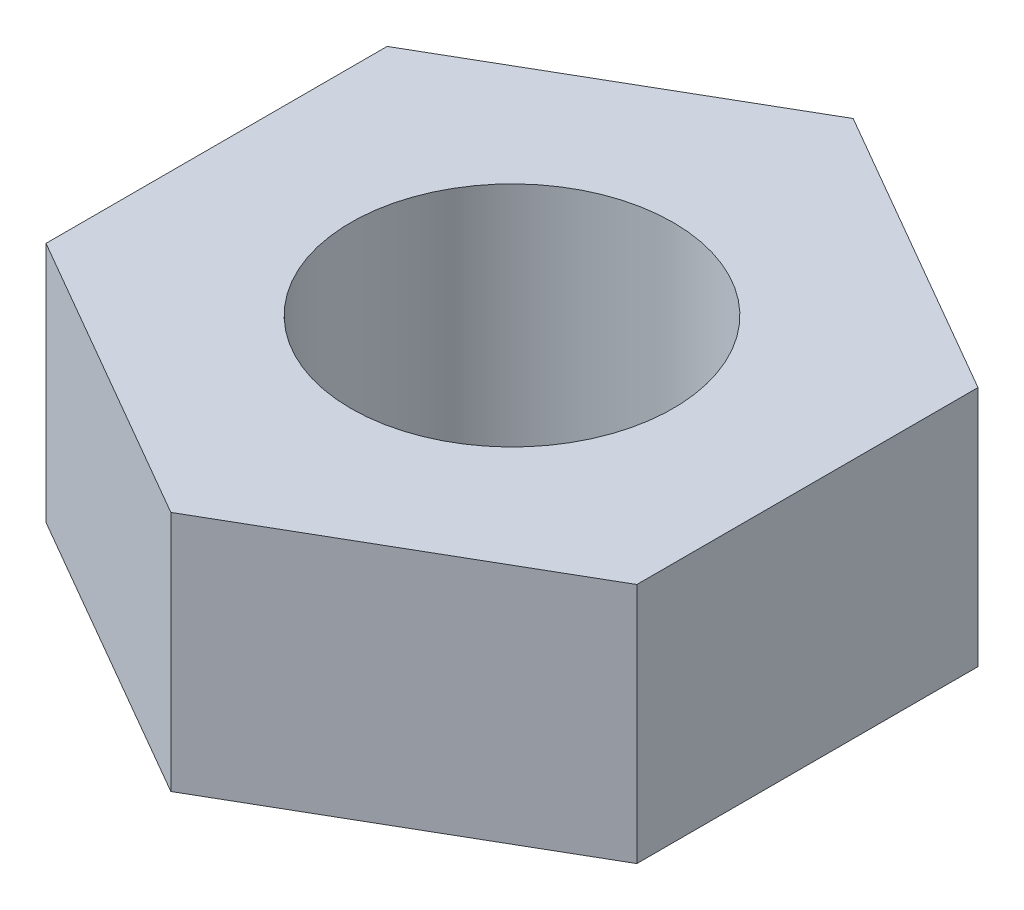
ISO-10303-21;
HEADER;
FILE_DESCRIPTION(('STEP AP214'),'2;1');
FILE_NAME('part.step','',(''),(''),'','','');
FILE_SCHEMA(('AUTOMOTIVE_DESIGN { 1 0 10303 214 1 1 1 1 }'));
ENDSEC;
DATA;
#1=APPLICATION_CONTEXT('core data for automotive mechanical design processes');
#2=APPLICATION_PROTOCOL_DEFINITION('international standard','automotive_design',2000,#1);
#3=PRODUCT_CONTEXT('',#1,'mechanical');
#4=PRODUCT('Part','Part','',(#3));
#5=PRODUCT_RELATED_PRODUCT_CATEGORY('part','',(#4));
#6=PRODUCT_DEFINITION_FORMATION('','',#4);
#7=PRODUCT_DEFINITION_CONTEXT('part definition',#1,'design');
#8=PRODUCT_DEFINITION('design','',#6,#7);
#9=PRODUCT_DEFINITION_SHAPE('','',#8);
#10=(LENGTH_UNIT() NAMED_UNIT(*) SI_UNIT(.MILLI.,.METRE.));
#11=(NAMED_UNIT(*) PLANE_ANGLE_UNIT() SI_UNIT($,.RADIAN.));
#12=(NAMED_UNIT(*) SI_UNIT($,.STERADIAN.) SOLID_ANGLE_UNIT());
#13=UNCERTAINTY_MEASURE_WITH_UNIT(LENGTH_MEASURE(1.E-05),#10,'distance_accuracy_value','');
#14=(GEOMETRIC_REPRESENTATION_CONTEXT(3) GLOBAL_UNCERTAINTY_ASSIGNED_CONTEXT((#13)) GLOBAL_UNIT_ASSIGNED_CONTEXT((#10,
#11,#12)) REPRESENTATION_CONTEXT('',''));
#15=CARTESIAN_POINT('',(0.,0.,0.));
#16=DIRECTION('',(0.,0.,1.));
#17=DIRECTION('',(1.,0.,0.));
#18=AXIS2_PLACEMENT_3D('',#15,#16,#17);
#19=CARTESIAN_POINT('',(0.,2.25,0.));
#20=DIRECTION('',(0.,1.,0.));
#21=DIRECTION('',(0.,0.,1.));
#22=AXIS2_PLACEMENT_3D('',#19,#20,#21);
#23=PLANE('',#22);
#24=DIRECTION('',(-0.866025403784438,0.,-0.5));
#25=VECTOR('',#24,1.);
#26=CARTESIAN_POINT('',(2.75,2.25,-1.58771324027147));
#27=LINE('',#26,#25);
#28=CARTESIAN_POINT('',(2.75,2.25,-1.58771324027147));
#29=VERTEX_POINT('',#28);
#30=CARTESIAN_POINT('',(0.,2.25,-3.17542648054294));
#31=VERTEX_POINT('',#30);
#32=EDGE_CURVE('E129',#29,#31,#27,.T.);
#33=ORIENTED_EDGE('',*,*,#32,.T.);
#34=DIRECTION('',(-0.866025403784439,0.,0.5));
#35=VECTOR('',#34,1.);
#36=CARTESIAN_POINT('',(0.,2.25,-3.17542648054294));
#37=LINE('',#36,#35);
#38=CARTESIAN_POINT('',(-2.75,2.25,-1.58771324027147));
#39=VERTEX_POINT('',#38);
#40=EDGE_CURVE('E87',#31,#39,#37,.T.);
#41=ORIENTED_EDGE('',*,*,#40,.T.);
#42=DIRECTION('',(0.,0.,1.));
#43=VECTOR('',#42,1.);
#44=CARTESIAN_POINT('',(-2.75,2.25,-1.58771324027147));
#45=LINE('',#44,#43);
#46=CARTESIAN_POINT('',(-2.75,2.25,1.58771324027147));
#47=VERTEX_POINT('',#46);
#48=EDGE_CURVE('E100',#39,#47,#45,.T.);
#49=ORIENTED_EDGE('',*,*,#48,.T.);
#50=DIRECTION('',(0.866025403784439,0.,0.5));
#51=VECTOR('',#50,1.);
#52=CARTESIAN_POINT('',(-2.75,2.25,1.58771324027147));
#53=LINE('',#52,#51);
#54=CARTESIAN_POINT('',(0.,2.25,3.17542648054294));
#55=VERTEX_POINT('',#54);
#56=EDGE_CURVE('E94',#47,#55,#53,.T.);
#57=ORIENTED_EDGE('',*,*,#56,.T.);
#58=DIRECTION('',(0.866025403784439,0.,-0.5));
#59=VECTOR('',#58,1.);
#60=CARTESIAN_POINT('',(0.,2.25,3.17542648054294));
#61=LINE('',#60,#59);
#62=CARTESIAN_POINT('',(2.75,2.25,1.58771324027147));
#63=VERTEX_POINT('',#62);
#64=EDGE_CURVE('E98',#55,#63,#61,.T.);
#65=ORIENTED_EDGE('',*,*,#64,.T.);
#66=DIRECTION('',(0.,0.,-1.));
#67=VECTOR('',#66,1.);
#68=CARTESIAN_POINT('',(2.75,2.25,1.58771324027147));
#69=LINE('',#68,#67);
#70=EDGE_CURVE('E50',#63,#29,#69,.T.);
#71=ORIENTED_EDGE('',*,*,#70,.T.);
#72=EDGE_LOOP('',(#33,#41,#49,#57,#65,#71));
#73=FACE_BOUND('',#72,.T.);
#74=CARTESIAN_POINT('',(0.,2.25,0.));
#75=DIRECTION('',(0.,1.,0.));
#76=DIRECTION('',(0.,0.,1.));
#77=AXIS2_PLACEMENT_3D('',#74,#75,#76);
#78=CIRCLE('',#77,1.5);
#79=CARTESIAN_POINT('',(0.,2.25,1.5));
#80=VERTEX_POINT('',#79);
#81=EDGE_CURVE('E122',#80,#80,#78,.T.);
#82=ORIENTED_EDGE('',*,*,#81,.F.);
#83=EDGE_LOOP('',(#82));
#84=FACE_BOUND('',#83,.T.);
#85=ADVANCED_FACE('F33',(#73,#84),#23,.T.);
#86=CARTESIAN_POINT('',(0.,0.,0.));
#87=DIRECTION('',(0.,1.,0.));
#88=DIRECTION('',(0.,0.,1.));
#89=AXIS2_PLACEMENT_3D('',#86,#87,#88);
#90=PLANE('',#89);
#91=DIRECTION('',(-0.866025403784438,0.,-0.5));
#92=VECTOR('',#91,1.);
#93=CARTESIAN_POINT('',(2.75,0.,-1.58771324027147));
#94=LINE('',#93,#92);
#95=CARTESIAN_POINT('',(2.75,0.,-1.58771324027147));
#96=VERTEX_POINT('',#95);
#97=CARTESIAN_POINT('',(0.,0.,-3.17542648054294));
#98=VERTEX_POINT('',#97);
#99=EDGE_CURVE('E118',#96,#98,#94,.T.);
#100=ORIENTED_EDGE('',*,*,#99,.F.);
#101=DIRECTION('',(0.,0.,-1.));
#102=VECTOR('',#101,1.);
#103=CARTESIAN_POINT('',(2.75,0.,1.58771324027147));
#104=LINE('',#103,#102);
#105=CARTESIAN_POINT('',(2.75,0.,1.58771324027147));
#106=VERTEX_POINT('',#105);
#107=EDGE_CURVE('E79',#106,#96,#104,.T.);
#108=ORIENTED_EDGE('',*,*,#107,.F.);
#109=DIRECTION('',(0.866025403784439,0.,-0.5));
#110=VECTOR('',#109,1.);
#111=CARTESIAN_POINT('',(0.,0.,3.17542648054294));
#112=LINE('',#111,#110);
#113=CARTESIAN_POINT('',(0.,0.,3.17542648054294));
#114=VERTEX_POINT('',#113);
#115=EDGE_CURVE('E73',#114,#106,#112,.T.);
#116=ORIENTED_EDGE('',*,*,#115,.F.);
#117=DIRECTION('',(0.866025403784439,0.,0.5));
#118=VECTOR('',#117,1.);
#119=CARTESIAN_POINT('',(-2.75,0.,1.58771324027147));
#120=LINE('',#119,#118);
#121=CARTESIAN_POINT('',(-2.75,0.,1.58771324027147));
#122=VERTEX_POINT('',#121);
#123=EDGE_CURVE('E108',#122,#114,#120,.T.);
#124=ORIENTED_EDGE('',*,*,#123,.F.);
#125=DIRECTION('',(0.,0.,1.));
#126=VECTOR('',#125,1.);
#127=CARTESIAN_POINT('',(-2.75,0.,-1.58771324027147));
#128=LINE('',#127,#126);
#129=CARTESIAN_POINT('',(-2.75,0.,-1.58771324027147));
#130=VERTEX_POINT('',#129);
#131=EDGE_CURVE('E124',#130,#122,#128,.T.);
#132=ORIENTED_EDGE('',*,*,#131,.F.);
#133=DIRECTION('',(-0.866025403784439,0.,0.5));
#134=VECTOR('',#133,1.);
#135=CARTESIAN_POINT('',(0.,0.,-3.17542648054294));
#136=LINE('',#135,#134);
#137=EDGE_CURVE('E121',#98,#130,#136,.T.);
#138=ORIENTED_EDGE('',*,*,#137,.F.);
#139=EDGE_LOOP('',(#100,#108,#116,#124,#132,#138));
#140=FACE_BOUND('',#139,.T.);
#141=CARTESIAN_POINT('',(0.,0.,0.));
#142=DIRECTION('',(0.,1.,0.));
#143=DIRECTION('',(0.,0.,1.));
#144=AXIS2_PLACEMENT_3D('',#141,#142,#143);
#145=CIRCLE('',#144,1.5);
#146=CARTESIAN_POINT('',(0.,0.,1.5));
#147=VERTEX_POINT('',#146);
#148=EDGE_CURVE('E222',#147,#147,#145,.T.);
#149=ORIENTED_EDGE('',*,*,#148,.T.);
#150=EDGE_LOOP('',(#149));
#151=FACE_BOUND('',#150,.T.);
#152=ADVANCED_FACE('F138',(#140,#151),#90,.F.);
#153=CARTESIAN_POINT('',(2.75,2.25,-1.58771324027147));
#154=DIRECTION('',(-0.5,0.,0.866025403784439));
#155=DIRECTION('',(0.866025403784439,0.,0.5));
#156=AXIS2_PLACEMENT_3D('',#153,#154,#155);
#157=PLANE('',#156);
#158=ORIENTED_EDGE('',*,*,#99,.T.);
#159=DIRECTION('',(0.,-1.,0.));
#160=VECTOR('',#159,1.);
#161=CARTESIAN_POINT('',(0.,2.25,-3.17542648054294));
#162=LINE('',#161,#160);
#163=EDGE_CURVE('E11',#31,#98,#162,.T.);
#164=ORIENTED_EDGE('',*,*,#163,.F.);
#165=ORIENTED_EDGE('',*,*,#32,.F.);
#166=DIRECTION('',(0.,-1.,0.));
#167=VECTOR('',#166,1.);
#168=CARTESIAN_POINT('',(2.75,2.25,-1.58771324027147));
#169=LINE('',#168,#167);
#170=EDGE_CURVE('E114',#29,#96,#169,.T.);
#171=ORIENTED_EDGE('',*,*,#170,.T.);
#172=EDGE_LOOP('',(#158,#164,#165,#171));
#173=FACE_BOUND('',#172,.T.);
#174=ADVANCED_FACE('F35',(#173),#157,.F.);
#175=CARTESIAN_POINT('',(0.,2.25,-3.17542648054294));
#176=DIRECTION('',(0.5,0.,0.866025403784439));
#177=DIRECTION('',(0.866025403784439,0.,-0.5));
#178=AXIS2_PLACEMENT_3D('',#175,#176,#177);
#179=PLANE('',#178);
#180=ORIENTED_EDGE('',*,*,#137,.T.);
#181=DIRECTION('',(0.,-1.,0.));
#182=VECTOR('',#181,1.);
#183=CARTESIAN_POINT('',(-2.75,2.25,-1.58771324027147));
#184=LINE('',#183,#182);
#185=EDGE_CURVE('E42',#39,#130,#184,.T.);
#186=ORIENTED_EDGE('',*,*,#185,.F.);
#187=ORIENTED_EDGE('',*,*,#40,.F.);
#188=ORIENTED_EDGE('',*,*,#163,.T.);
#189=EDGE_LOOP('',(#180,#186,#187,#188));
#190=FACE_BOUND('',#189,.T.);
#191=ADVANCED_FACE('F163',(#190),#179,.F.);
#192=CARTESIAN_POINT('',(-2.75,2.25,-1.58771324027147));
#193=DIRECTION('',(1.,0.,0.));
#194=DIRECTION('',(0.,0.,-1.));
#195=AXIS2_PLACEMENT_3D('',#192,#193,#194);
#196=PLANE('',#195);
#197=ORIENTED_EDGE('',*,*,#131,.T.);
#198=DIRECTION('',(0.,-1.,0.));
#199=VECTOR('',#198,1.);
#200=CARTESIAN_POINT('',(-2.75,2.25,1.58771324027147));
#201=LINE('',#200,#199);
#202=EDGE_CURVE('E109',#47,#122,#201,.T.);
#203=ORIENTED_EDGE('',*,*,#202,.F.);
#204=ORIENTED_EDGE('',*,*,#48,.F.);
#205=ORIENTED_EDGE('',*,*,#185,.T.);
#206=EDGE_LOOP('',(#197,#203,#204,#205));
#207=FACE_BOUND('',#206,.T.);
#208=ADVANCED_FACE('F135',(#207),#196,.F.);
#209=CARTESIAN_POINT('',(-2.75,2.25,1.58771324027147));
#210=DIRECTION('',(0.5,0.,-0.866025403784439));
#211=DIRECTION('',(-0.866025403784439,0.,-0.5));
#212=AXIS2_PLACEMENT_3D('',#209,#210,#211);
#213=PLANE('',#212);
#214=ORIENTED_EDGE('',*,*,#123,.T.);
#215=DIRECTION('',(0.,-1.,0.));
#216=VECTOR('',#215,1.);
#217=CARTESIAN_POINT('',(0.,2.25,3.17542648054294));
#218=LINE('',#217,#216);
#219=EDGE_CURVE('E105',#55,#114,#218,.T.);
#220=ORIENTED_EDGE('',*,*,#219,.F.);
#221=ORIENTED_EDGE('',*,*,#56,.F.);
#222=ORIENTED_EDGE('',*,*,#202,.T.);
#223=EDGE_LOOP('',(#214,#220,#221,#222));
#224=FACE_BOUND('',#223,.T.);
#225=ADVANCED_FACE('F106',(#224),#213,.F.);
#226=CARTESIAN_POINT('',(0.,2.25,3.17542648054294));
#227=DIRECTION('',(-0.5,0.,-0.866025403784439));
#228=DIRECTION('',(-0.866025403784439,0.,0.5));
#229=AXIS2_PLACEMENT_3D('',#226,#227,#228);
#230=PLANE('',#229);
#231=ORIENTED_EDGE('',*,*,#115,.T.);
#232=DIRECTION('',(0.,-1.,0.));
#233=VECTOR('',#232,1.);
#234=CARTESIAN_POINT('',(2.75,2.25,1.58771324027147));
#235=LINE('',#234,#233);
#236=EDGE_CURVE('E110',#63,#106,#235,.T.);
#237=ORIENTED_EDGE('',*,*,#236,.F.);
#238=ORIENTED_EDGE('',*,*,#64,.F.);
#239=ORIENTED_EDGE('',*,*,#219,.T.);
#240=EDGE_LOOP('',(#231,#237,#238,#239));
#241=FACE_BOUND('',#240,.T.);
#242=ADVANCED_FACE('F112',(#241),#230,.F.);
#243=CARTESIAN_POINT('',(2.75,2.25,1.58771324027147));
#244=DIRECTION('',(-1.,0.,0.));
#245=DIRECTION('',(0.,0.,1.));
#246=AXIS2_PLACEMENT_3D('',#243,#244,#245);
#247=PLANE('',#246);
#248=ORIENTED_EDGE('',*,*,#107,.T.);
#249=ORIENTED_EDGE('',*,*,#170,.F.);
#250=ORIENTED_EDGE('',*,*,#70,.F.);
#251=ORIENTED_EDGE('',*,*,#236,.T.);
#252=EDGE_LOOP('',(#248,#249,#250,#251));
#253=FACE_BOUND('',#252,.T.);
#254=ADVANCED_FACE('F143',(#253),#247,.F.);
#255=CARTESIAN_POINT('',(0.,2.25,0.));
#256=DIRECTION('',(0.,-1.,0.));
#257=DIRECTION('',(0.,0.,-1.));
#258=AXIS2_PLACEMENT_3D('',#255,#256,#257);
#259=CYLINDRICAL_SURFACE('',#258,1.5);
#260=ORIENTED_EDGE('',*,*,#81,.T.);
#261=EDGE_LOOP('',(#260));
#262=FACE_BOUND('',#261,.T.);
#263=ORIENTED_EDGE('',*,*,#148,.F.);
#264=EDGE_LOOP('',(#263));
#265=FACE_BOUND('',#264,.T.);
#266=ADVANCED_FACE('F145',(#262,#265),#259,.F.);
#267=CLOSED_SHELL('',(#85,#152,#174,#191,#208,#225,#242,#254,#266));
#268=MANIFOLD_SOLID_BREP('B2',#267);
#269=ADVANCED_BREP_SHAPE_REPRESENTATION('',(#18,#268),#14);
#270=SHAPE_DEFINITION_REPRESENTATION(#9,#269);
ENDSEC;
END-ISO-10303-21;
